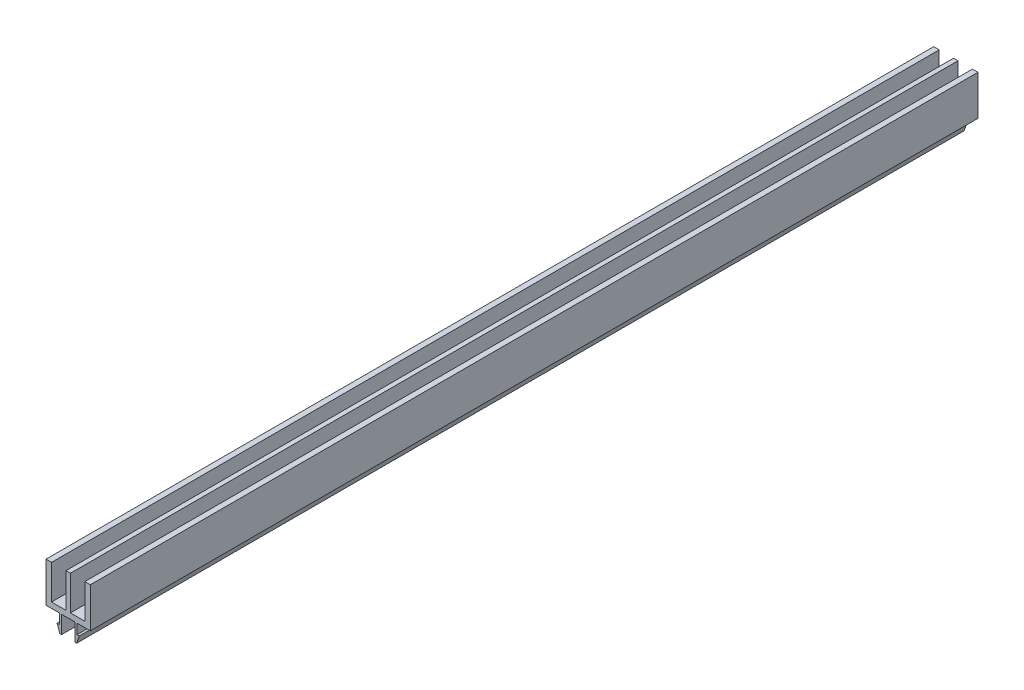
ISO-10303-21;
HEADER;
FILE_DESCRIPTION(('STEP AP214'),'2;1');
FILE_NAME('part.step','',(''),(''),'','','');
FILE_SCHEMA(('AUTOMOTIVE_DESIGN { 1 0 10303 214 1 1 1 1 }'));
ENDSEC;
DATA;
#1=APPLICATION_CONTEXT('core data for automotive mechanical design processes');
#2=APPLICATION_PROTOCOL_DEFINITION('international standard','automotive_design',2000,#1);
#3=PRODUCT_CONTEXT('',#1,'mechanical');
#4=PRODUCT('Part','Part','',(#3));
#5=PRODUCT_RELATED_PRODUCT_CATEGORY('part','',(#4));
#6=PRODUCT_DEFINITION_FORMATION('','',#4);
#7=PRODUCT_DEFINITION_CONTEXT('part definition',#1,'design');
#8=PRODUCT_DEFINITION('design','',#6,#7);
#9=PRODUCT_DEFINITION_SHAPE('','',#8);
#10=(LENGTH_UNIT() NAMED_UNIT(*) SI_UNIT(.MILLI.,.METRE.));
#11=(NAMED_UNIT(*) PLANE_ANGLE_UNIT() SI_UNIT($,.RADIAN.));
#12=(NAMED_UNIT(*) SI_UNIT($,.STERADIAN.) SOLID_ANGLE_UNIT());
#13=UNCERTAINTY_MEASURE_WITH_UNIT(LENGTH_MEASURE(1.E-05),#10,'distance_accuracy_value','');
#14=(GEOMETRIC_REPRESENTATION_CONTEXT(3) GLOBAL_UNCERTAINTY_ASSIGNED_CONTEXT((#13)) GLOBAL_UNIT_ASSIGNED_CONTEXT((#10,
#11,#12)) REPRESENTATION_CONTEXT('',''));
#15=CARTESIAN_POINT('',(0.,0.,0.));
#16=DIRECTION('',(0.,0.,1.));
#17=DIRECTION('',(1.,0.,0.));
#18=AXIS2_PLACEMENT_3D('',#15,#16,#17);
#19=CARTESIAN_POINT('',(-1.,17.9999999975,-350.29));
#20=DIRECTION('',(-1.,0.,0.));
#21=DIRECTION('',(0.,-1.,0.));
#22=AXIS2_PLACEMENT_3D('',#19,#20,#21);
#23=PLANE('',#22);
#24=DIRECTION('',(0.,-1.,0.));
#25=VECTOR('',#24,1.);
#26=CARTESIAN_POINT('',(-1.,17.9999999975,50.));
#27=LINE('',#26,#25);
#28=CARTESIAN_POINT('',(-1.,17.9999999975,50.));
#29=VERTEX_POINT('',#28);
#30=CARTESIAN_POINT('',(-1.,2.4999999995,50.));
#31=VERTEX_POINT('',#30);
#32=EDGE_CURVE('E225',#29,#31,#27,.T.);
#33=ORIENTED_EDGE('',*,*,#32,.F.);
#34=DIRECTION('',(0.,0.,1.));
#35=VECTOR('',#34,1.);
#36=CARTESIAN_POINT('',(-1.,17.9999999975,-350.29));
#37=LINE('',#36,#35);
#38=CARTESIAN_POINT('',(-1.,17.9999999975,-350.29));
#39=VERTEX_POINT('',#38);
#40=EDGE_CURVE('E11',#39,#29,#37,.T.);
#41=ORIENTED_EDGE('',*,*,#40,.F.);
#42=DIRECTION('',(0.,-1.,0.));
#43=VECTOR('',#42,1.);
#44=CARTESIAN_POINT('',(-1.,17.9999999975,-350.29));
#45=LINE('',#44,#43);
#46=CARTESIAN_POINT('',(-1.,2.4999999995,-350.29));
#47=VERTEX_POINT('',#46);
#48=EDGE_CURVE('E293',#39,#47,#45,.T.);
#49=ORIENTED_EDGE('',*,*,#48,.T.);
#50=DIRECTION('',(0.,0.,1.));
#51=VECTOR('',#50,1.);
#52=CARTESIAN_POINT('',(-1.,2.4999999995,-350.29));
#53=LINE('',#52,#51);
#54=EDGE_CURVE('E35',#47,#31,#53,.T.);
#55=ORIENTED_EDGE('',*,*,#54,.T.);
#56=EDGE_LOOP('',(#33,#41,#49,#55));
#57=FACE_BOUND('',#56,.T.);
#58=ADVANCED_FACE('F32',(#57),#23,.T.);
#59=CARTESIAN_POINT('',(0.999999999999998,17.9999999975,-350.29));
#60=DIRECTION('',(0.,1.,0.));
#61=DIRECTION('',(0.,0.,1.));
#62=AXIS2_PLACEMENT_3D('',#59,#60,#61);
#63=PLANE('',#62);
#64=DIRECTION('',(-1.,0.,0.));
#65=VECTOR('',#64,1.);
#66=CARTESIAN_POINT('',(0.999999999999998,17.9999999975,50.));
#67=LINE('',#66,#65);
#68=CARTESIAN_POINT('',(0.999999999999998,17.9999999975,50.));
#69=VERTEX_POINT('',#68);
#70=EDGE_CURVE('E291',#69,#29,#67,.T.);
#71=ORIENTED_EDGE('',*,*,#70,.F.);
#72=DIRECTION('',(0.,0.,1.));
#73=VECTOR('',#72,1.);
#74=CARTESIAN_POINT('',(0.999999999999998,17.9999999975,-350.29));
#75=LINE('',#74,#73);
#76=CARTESIAN_POINT('',(0.999999999999998,17.9999999975,-350.29));
#77=VERTEX_POINT('',#76);
#78=EDGE_CURVE('E41',#77,#69,#75,.T.);
#79=ORIENTED_EDGE('',*,*,#78,.F.);
#80=DIRECTION('',(-1.,0.,0.));
#81=VECTOR('',#80,1.);
#82=CARTESIAN_POINT('',(0.999999999999998,17.9999999975,-350.29));
#83=LINE('',#82,#81);
#84=EDGE_CURVE('E215',#77,#39,#83,.T.);
#85=ORIENTED_EDGE('',*,*,#84,.T.);
#86=ORIENTED_EDGE('',*,*,#40,.T.);
#87=EDGE_LOOP('',(#71,#79,#85,#86));
#88=FACE_BOUND('',#87,.T.);
#89=ADVANCED_FACE('F337',(#88),#63,.T.);
#90=CARTESIAN_POINT('',(0.999999999999998,2.4999999995,-350.29));
#91=DIRECTION('',(1.,0.,0.));
#92=DIRECTION('',(0.,0.,-1.));
#93=AXIS2_PLACEMENT_3D('',#90,#91,#92);
#94=PLANE('',#93);
#95=DIRECTION('',(0.,1.,0.));
#96=VECTOR('',#95,1.);
#97=CARTESIAN_POINT('',(0.999999999999998,2.4999999995,50.));
#98=LINE('',#97,#96);
#99=CARTESIAN_POINT('',(0.999999999999998,2.4999999995,50.));
#100=VERTEX_POINT('',#99);
#101=EDGE_CURVE('E202',#100,#69,#98,.T.);
#102=ORIENTED_EDGE('',*,*,#101,.F.);
#103=DIRECTION('',(0.,0.,1.));
#104=VECTOR('',#103,1.);
#105=CARTESIAN_POINT('',(0.999999999999998,2.4999999995,-350.29));
#106=LINE('',#105,#104);
#107=CARTESIAN_POINT('',(0.999999999999998,2.4999999995,-350.29));
#108=VERTEX_POINT('',#107);
#109=EDGE_CURVE('E197',#108,#100,#106,.T.);
#110=ORIENTED_EDGE('',*,*,#109,.F.);
#111=DIRECTION('',(0.,1.,0.));
#112=VECTOR('',#111,1.);
#113=CARTESIAN_POINT('',(0.999999999999998,2.4999999995,-350.29));
#114=LINE('',#113,#112);
#115=EDGE_CURVE('E200',#108,#77,#114,.T.);
#116=ORIENTED_EDGE('',*,*,#115,.T.);
#117=ORIENTED_EDGE('',*,*,#78,.T.);
#118=EDGE_LOOP('',(#102,#110,#116,#117));
#119=FACE_BOUND('',#118,.T.);
#120=ADVANCED_FACE('F199',(#119),#94,.T.);
#121=CARTESIAN_POINT('',(7.5,2.4999999995,-350.29));
#122=DIRECTION('',(0.,1.,0.));
#123=DIRECTION('',(-1.,0.,0.));
#124=AXIS2_PLACEMENT_3D('',#121,#122,#123);
#125=PLANE('',#124);
#126=DIRECTION('',(-1.,0.,0.));
#127=VECTOR('',#126,1.);
#128=CARTESIAN_POINT('',(7.5,2.4999999995,50.));
#129=LINE('',#128,#127);
#130=CARTESIAN_POINT('',(7.5,2.4999999995,50.));
#131=VERTEX_POINT('',#130);
#132=EDGE_CURVE('E288',#131,#100,#129,.T.);
#133=ORIENTED_EDGE('',*,*,#132,.F.);
#134=DIRECTION('',(0.,0.,1.));
#135=VECTOR('',#134,1.);
#136=CARTESIAN_POINT('',(7.5,2.4999999995,-350.29));
#137=LINE('',#136,#135);
#138=CARTESIAN_POINT('',(7.5,2.4999999995,-350.29));
#139=VERTEX_POINT('',#138);
#140=EDGE_CURVE('E207',#139,#131,#137,.T.);
#141=ORIENTED_EDGE('',*,*,#140,.F.);
#142=DIRECTION('',(-1.,0.,0.));
#143=VECTOR('',#142,1.);
#144=CARTESIAN_POINT('',(7.5,2.4999999995,-350.29));
#145=LINE('',#144,#143);
#146=EDGE_CURVE('E213',#139,#108,#145,.T.);
#147=ORIENTED_EDGE('',*,*,#146,.T.);
#148=ORIENTED_EDGE('',*,*,#109,.T.);
#149=EDGE_LOOP('',(#133,#141,#147,#148));
#150=FACE_BOUND('',#149,.T.);
#151=ADVANCED_FACE('F217',(#150),#125,.T.);
#152=CARTESIAN_POINT('',(7.5,17.9999999975,-350.29));
#153=DIRECTION('',(-1.,0.,0.));
#154=DIRECTION('',(0.,-1.,0.));
#155=AXIS2_PLACEMENT_3D('',#152,#153,#154);
#156=PLANE('',#155);
#157=DIRECTION('',(0.,-1.,0.));
#158=VECTOR('',#157,1.);
#159=CARTESIAN_POINT('',(7.5,17.9999999975,50.));
#160=LINE('',#159,#158);
#161=CARTESIAN_POINT('',(7.5,17.9999999975,50.));
#162=VERTEX_POINT('',#161);
#163=EDGE_CURVE('E285',#162,#131,#160,.T.);
#164=ORIENTED_EDGE('',*,*,#163,.F.);
#165=DIRECTION('',(0.,0.,1.));
#166=VECTOR('',#165,1.);
#167=CARTESIAN_POINT('',(7.5,17.9999999975,-350.29));
#168=LINE('',#167,#166);
#169=CARTESIAN_POINT('',(7.5,17.9999999975,-350.29));
#170=VERTEX_POINT('',#169);
#171=EDGE_CURVE('E297',#170,#162,#168,.T.);
#172=ORIENTED_EDGE('',*,*,#171,.F.);
#173=DIRECTION('',(0.,-1.,0.));
#174=VECTOR('',#173,1.);
#175=CARTESIAN_POINT('',(7.5,17.9999999975,-350.29));
#176=LINE('',#175,#174);
#177=EDGE_CURVE('E218',#170,#139,#176,.T.);
#178=ORIENTED_EDGE('',*,*,#177,.T.);
#179=ORIENTED_EDGE('',*,*,#140,.T.);
#180=EDGE_LOOP('',(#164,#172,#178,#179));
#181=FACE_BOUND('',#180,.T.);
#182=ADVANCED_FACE('F350',(#181),#156,.T.);
#183=CARTESIAN_POINT('',(10.,17.9999999975,-350.29));
#184=DIRECTION('',(0.,1.,0.));
#185=DIRECTION('',(0.,0.,1.));
#186=AXIS2_PLACEMENT_3D('',#183,#184,#185);
#187=PLANE('',#186);
#188=DIRECTION('',(-1.,0.,0.));
#189=VECTOR('',#188,1.);
#190=CARTESIAN_POINT('',(10.,17.9999999975,50.));
#191=LINE('',#190,#189);
#192=CARTESIAN_POINT('',(10.,17.9999999975,50.));
#193=VERTEX_POINT('',#192);
#194=EDGE_CURVE('E282',#193,#162,#191,.T.);
#195=ORIENTED_EDGE('',*,*,#194,.F.);
#196=DIRECTION('',(0.,0.,1.));
#197=VECTOR('',#196,1.);
#198=CARTESIAN_POINT('',(10.,17.9999999975,-350.29));
#199=LINE('',#198,#197);
#200=CARTESIAN_POINT('',(10.,17.9999999975,-350.29));
#201=VERTEX_POINT('',#200);
#202=EDGE_CURVE('E299',#201,#193,#199,.T.);
#203=ORIENTED_EDGE('',*,*,#202,.F.);
#204=DIRECTION('',(-1.,0.,0.));
#205=VECTOR('',#204,1.);
#206=CARTESIAN_POINT('',(10.,17.9999999975,-350.29));
#207=LINE('',#206,#205);
#208=EDGE_CURVE('E220',#201,#170,#207,.T.);
#209=ORIENTED_EDGE('',*,*,#208,.T.);
#210=ORIENTED_EDGE('',*,*,#171,.T.);
#211=EDGE_LOOP('',(#195,#203,#209,#210));
#212=FACE_BOUND('',#211,.T.);
#213=ADVANCED_FACE('F353',(#212),#187,.T.);
#214=CARTESIAN_POINT('',(10.,-4.99999828349541E-10,-350.29));
#215=DIRECTION('',(1.,0.,0.));
#216=DIRECTION('',(0.,0.,-1.));
#217=AXIS2_PLACEMENT_3D('',#214,#215,#216);
#218=PLANE('',#217);
#219=DIRECTION('',(0.,1.,0.));
#220=VECTOR('',#219,1.);
#221=CARTESIAN_POINT('',(10.,-4.99999828349541E-10,50.));
#222=LINE('',#221,#220);
#223=CARTESIAN_POINT('',(10.,-4.99999828349541E-10,50.));
#224=VERTEX_POINT('',#223);
#225=EDGE_CURVE('E279',#224,#193,#222,.T.);
#226=ORIENTED_EDGE('',*,*,#225,.F.);
#227=DIRECTION('',(0.,0.,1.));
#228=VECTOR('',#227,1.);
#229=CARTESIAN_POINT('',(10.,-4.99999828349541E-10,-350.29));
#230=LINE('',#229,#228);
#231=CARTESIAN_POINT('',(10.,-4.99999828349541E-10,-350.29));
#232=VERTEX_POINT('',#231);
#233=EDGE_CURVE('E301',#232,#224,#230,.T.);
#234=ORIENTED_EDGE('',*,*,#233,.F.);
#235=DIRECTION('',(0.,1.,0.));
#236=VECTOR('',#235,1.);
#237=CARTESIAN_POINT('',(10.,-4.99999828349541E-10,-350.29));
#238=LINE('',#237,#236);
#239=EDGE_CURVE('E643',#232,#201,#238,.T.);
#240=ORIENTED_EDGE('',*,*,#239,.T.);
#241=ORIENTED_EDGE('',*,*,#202,.T.);
#242=EDGE_LOOP('',(#226,#234,#240,#241));
#243=FACE_BOUND('',#242,.T.);
#244=ADVANCED_FACE('F357',(#243),#218,.T.);
#245=CARTESIAN_POINT('',(4.,-4.99999998002099E-10,-350.29));
#246=DIRECTION('',(0.,-1.,0.));
#247=DIRECTION('',(1.,0.,0.));
#248=AXIS2_PLACEMENT_3D('',#245,#246,#247);
#249=PLANE('',#248);
#250=DIRECTION('',(1.,0.,0.));
#251=VECTOR('',#250,1.);
#252=CARTESIAN_POINT('',(4.,-4.99999998002099E-10,50.));
#253=LINE('',#252,#251);
#254=CARTESIAN_POINT('',(4.,-4.99999998002099E-10,50.));
#255=VERTEX_POINT('',#254);
#256=EDGE_CURVE('E276',#255,#224,#253,.T.);
#257=ORIENTED_EDGE('',*,*,#256,.F.);
#258=DIRECTION('',(0.,0.,1.));
#259=VECTOR('',#258,1.);
#260=CARTESIAN_POINT('',(4.,-4.99999998002099E-10,-350.29));
#261=LINE('',#260,#259);
#262=CARTESIAN_POINT('',(4.,-4.99999998002099E-10,-350.29));
#263=VERTEX_POINT('',#262);
#264=EDGE_CURVE('E303',#263,#255,#261,.T.);
#265=ORIENTED_EDGE('',*,*,#264,.F.);
#266=DIRECTION('',(1.,0.,0.));
#267=VECTOR('',#266,1.);
#268=CARTESIAN_POINT('',(4.,-4.99999998002099E-10,-350.29));
#269=LINE('',#268,#267);
#270=EDGE_CURVE('E647',#263,#232,#269,.T.);
#271=ORIENTED_EDGE('',*,*,#270,.T.);
#272=ORIENTED_EDGE('',*,*,#233,.T.);
#273=EDGE_LOOP('',(#257,#265,#271,#272));
#274=FACE_BOUND('',#273,.T.);
#275=ADVANCED_FACE('F361',(#274),#249,.T.);
#276=CARTESIAN_POINT('',(4.,-4.5,-350.29));
#277=DIRECTION('',(1.,0.,0.));
#278=DIRECTION('',(0.,0.,-1.));
#279=AXIS2_PLACEMENT_3D('',#276,#277,#278);
#280=PLANE('',#279);
#281=DIRECTION('',(0.,1.,0.));
#282=VECTOR('',#281,1.);
#283=CARTESIAN_POINT('',(4.,-4.5,50.));
#284=LINE('',#283,#282);
#285=CARTESIAN_POINT('',(4.,-4.5,50.));
#286=VERTEX_POINT('',#285);
#287=EDGE_CURVE('E273',#286,#255,#284,.T.);
#288=ORIENTED_EDGE('',*,*,#287,.F.);
#289=DIRECTION('',(0.,0.,1.));
#290=VECTOR('',#289,1.);
#291=CARTESIAN_POINT('',(4.,-4.5,-350.29));
#292=LINE('',#291,#290);
#293=CARTESIAN_POINT('',(4.,-4.5,-350.29));
#294=VERTEX_POINT('',#293);
#295=EDGE_CURVE('E305',#294,#286,#292,.T.);
#296=ORIENTED_EDGE('',*,*,#295,.F.);
#297=DIRECTION('',(0.,1.,0.));
#298=VECTOR('',#297,1.);
#299=CARTESIAN_POINT('',(4.,-4.5,-350.29));
#300=LINE('',#299,#298);
#301=EDGE_CURVE('E636',#294,#263,#300,.T.);
#302=ORIENTED_EDGE('',*,*,#301,.T.);
#303=ORIENTED_EDGE('',*,*,#264,.T.);
#304=EDGE_LOOP('',(#288,#296,#302,#303));
#305=FACE_BOUND('',#304,.T.);
#306=ADVANCED_FACE('F365',(#305),#280,.T.);
#307=CARTESIAN_POINT('',(5.,-4.5,-350.29));
#308=DIRECTION('',(0.,1.,0.));
#309=DIRECTION('',(0.,0.,1.));
#310=AXIS2_PLACEMENT_3D('',#307,#308,#309);
#311=PLANE('',#310);
#312=DIRECTION('',(-1.,0.,0.));
#313=VECTOR('',#312,1.);
#314=CARTESIAN_POINT('',(5.,-4.5,50.));
#315=LINE('',#314,#313);
#316=CARTESIAN_POINT('',(5.,-4.5,50.));
#317=VERTEX_POINT('',#316);
#318=EDGE_CURVE('E270',#317,#286,#315,.T.);
#319=ORIENTED_EDGE('',*,*,#318,.F.);
#320=DIRECTION('',(0.,0.,1.));
#321=VECTOR('',#320,1.);
#322=CARTESIAN_POINT('',(5.,-4.5,-350.29));
#323=LINE('',#322,#321);
#324=CARTESIAN_POINT('',(5.,-4.5,-350.29));
#325=VERTEX_POINT('',#324);
#326=EDGE_CURVE('E307',#325,#317,#323,.T.);
#327=ORIENTED_EDGE('',*,*,#326,.F.);
#328=DIRECTION('',(-1.,0.,0.));
#329=VECTOR('',#328,1.);
#330=CARTESIAN_POINT('',(5.,-4.5,-350.29));
#331=LINE('',#330,#329);
#332=EDGE_CURVE('E632',#325,#294,#331,.T.);
#333=ORIENTED_EDGE('',*,*,#332,.T.);
#334=ORIENTED_EDGE('',*,*,#295,.T.);
#335=EDGE_LOOP('',(#319,#327,#333,#334));
#336=FACE_BOUND('',#335,.T.);
#337=ADVANCED_FACE('F369',(#336),#311,.T.);
#338=CARTESIAN_POINT('',(3.75,-8.,-350.29));
#339=DIRECTION('',(0.941741911594837,-0.336336396998157,0.));
#340=DIRECTION('',(0.336336396998157,0.941741911594837,0.));
#341=AXIS2_PLACEMENT_3D('',#338,#339,#340);
#342=PLANE('',#341);
#343=DIRECTION('',(0.336336396998157,0.941741911594837,0.));
#344=VECTOR('',#343,1.);
#345=CARTESIAN_POINT('',(3.75,-8.,50.));
#346=LINE('',#345,#344);
#347=CARTESIAN_POINT('',(3.75,-8.,50.));
#348=VERTEX_POINT('',#347);
#349=EDGE_CURVE('E267',#348,#317,#346,.T.);
#350=ORIENTED_EDGE('',*,*,#349,.F.);
#351=DIRECTION('',(0.,0.,1.));
#352=VECTOR('',#351,1.);
#353=CARTESIAN_POINT('',(3.75,-8.,-350.29));
#354=LINE('',#353,#352);
#355=CARTESIAN_POINT('',(3.75,-8.,-350.29));
#356=VERTEX_POINT('',#355);
#357=EDGE_CURVE('E309',#356,#348,#354,.T.);
#358=ORIENTED_EDGE('',*,*,#357,.F.);
#359=DIRECTION('',(0.336336396998157,0.941741911594837,0.));
#360=VECTOR('',#359,1.);
#361=CARTESIAN_POINT('',(3.75,-8.,-350.29));
#362=LINE('',#361,#360);
#363=EDGE_CURVE('E653',#356,#325,#362,.T.);
#364=ORIENTED_EDGE('',*,*,#363,.T.);
#365=ORIENTED_EDGE('',*,*,#326,.T.);
#366=EDGE_LOOP('',(#350,#358,#364,#365));
#367=FACE_BOUND('',#366,.T.);
#368=ADVANCED_FACE('F373',(#367),#342,.T.);
#369=CARTESIAN_POINT('',(3.,-8.,-350.29));
#370=DIRECTION('',(0.,-1.,0.));
#371=DIRECTION('',(0.,0.,-1.));
#372=AXIS2_PLACEMENT_3D('',#369,#370,#371);
#373=PLANE('',#372);
#374=DIRECTION('',(1.,0.,0.));
#375=VECTOR('',#374,1.);
#376=CARTESIAN_POINT('',(3.,-8.,50.));
#377=LINE('',#376,#375);
#378=CARTESIAN_POINT('',(3.,-8.,50.));
#379=VERTEX_POINT('',#378);
#380=EDGE_CURVE('E264',#379,#348,#377,.T.);
#381=ORIENTED_EDGE('',*,*,#380,.F.);
#382=DIRECTION('',(0.,0.,1.));
#383=VECTOR('',#382,1.);
#384=CARTESIAN_POINT('',(3.,-8.,-350.29));
#385=LINE('',#384,#383);
#386=CARTESIAN_POINT('',(3.,-8.,-350.29));
#387=VERTEX_POINT('',#386);
#388=EDGE_CURVE('E311',#387,#379,#385,.T.);
#389=ORIENTED_EDGE('',*,*,#388,.F.);
#390=DIRECTION('',(1.,0.,0.));
#391=VECTOR('',#390,1.);
#392=CARTESIAN_POINT('',(3.,-8.,-350.29));
#393=LINE('',#392,#391);
#394=EDGE_CURVE('E625',#387,#356,#393,.T.);
#395=ORIENTED_EDGE('',*,*,#394,.T.);
#396=ORIENTED_EDGE('',*,*,#357,.T.);
#397=EDGE_LOOP('',(#381,#389,#395,#396));
#398=FACE_BOUND('',#397,.T.);
#399=ADVANCED_FACE('F377',(#398),#373,.T.);
#400=CARTESIAN_POINT('',(3.,-4.9999985194348E-10,-350.29));
#401=DIRECTION('',(-1.,0.,0.));
#402=DIRECTION('',(0.,0.,1.));
#403=AXIS2_PLACEMENT_3D('',#400,#401,#402);
#404=PLANE('',#403);
#405=DIRECTION('',(0.,-1.,0.));
#406=VECTOR('',#405,1.);
#407=CARTESIAN_POINT('',(3.,-4.9999985194348E-10,50.));
#408=LINE('',#407,#406);
#409=CARTESIAN_POINT('',(3.,-4.9999985194348E-10,50.));
#410=VERTEX_POINT('',#409);
#411=EDGE_CURVE('E261',#410,#379,#408,.T.);
#412=ORIENTED_EDGE('',*,*,#411,.F.);
#413=DIRECTION('',(0.,0.,1.));
#414=VECTOR('',#413,1.);
#415=CARTESIAN_POINT('',(3.,-4.9999985194348E-10,-350.29));
#416=LINE('',#415,#414);
#417=CARTESIAN_POINT('',(3.,-4.9999985194348E-10,-350.29));
#418=VERTEX_POINT('',#417);
#419=EDGE_CURVE('E313',#418,#410,#416,.T.);
#420=ORIENTED_EDGE('',*,*,#419,.F.);
#421=DIRECTION('',(0.,-1.,0.));
#422=VECTOR('',#421,1.);
#423=CARTESIAN_POINT('',(3.,-4.9999985194348E-10,-350.29));
#424=LINE('',#423,#422);
#425=EDGE_CURVE('E621',#418,#387,#424,.T.);
#426=ORIENTED_EDGE('',*,*,#425,.T.);
#427=ORIENTED_EDGE('',*,*,#388,.T.);
#428=EDGE_LOOP('',(#412,#420,#426,#427));
#429=FACE_BOUND('',#428,.T.);
#430=ADVANCED_FACE('F381',(#429),#404,.T.);
#431=CARTESIAN_POINT('',(-3.,-4.99999455901012E-10,-350.29));
#432=DIRECTION('',(0.,-1.,0.));
#433=DIRECTION('',(1.,0.,0.));
#434=AXIS2_PLACEMENT_3D('',#431,#432,#433);
#435=PLANE('',#434);
#436=DIRECTION('',(1.,0.,0.));
#437=VECTOR('',#436,1.);
#438=CARTESIAN_POINT('',(-3.,-4.99999455901012E-10,50.));
#439=LINE('',#438,#437);
#440=CARTESIAN_POINT('',(-3.,-4.99999455901012E-10,50.));
#441=VERTEX_POINT('',#440);
#442=EDGE_CURVE('E258',#441,#410,#439,.T.);
#443=ORIENTED_EDGE('',*,*,#442,.F.);
#444=DIRECTION('',(0.,0.,1.));
#445=VECTOR('',#444,1.);
#446=CARTESIAN_POINT('',(-3.,-4.99999455901012E-10,-350.29));
#447=LINE('',#446,#445);
#448=CARTESIAN_POINT('',(-3.,-4.99999455901012E-10,-350.29));
#449=VERTEX_POINT('',#448);
#450=EDGE_CURVE('E315',#449,#441,#447,.T.);
#451=ORIENTED_EDGE('',*,*,#450,.F.);
#452=DIRECTION('',(1.,0.,0.));
#453=VECTOR('',#452,1.);
#454=CARTESIAN_POINT('',(-3.,-4.99999455901012E-10,-350.29));
#455=LINE('',#454,#453);
#456=EDGE_CURVE('E657',#449,#418,#455,.T.);
#457=ORIENTED_EDGE('',*,*,#456,.T.);
#458=ORIENTED_EDGE('',*,*,#419,.T.);
#459=EDGE_LOOP('',(#443,#451,#457,#458));
#460=FACE_BOUND('',#459,.T.);
#461=ADVANCED_FACE('F385',(#460),#435,.T.);
#462=CARTESIAN_POINT('',(-3.,-8.,-350.29));
#463=DIRECTION('',(1.,0.,0.));
#464=DIRECTION('',(0.,0.,-1.));
#465=AXIS2_PLACEMENT_3D('',#462,#463,#464);
#466=PLANE('',#465);
#467=DIRECTION('',(0.,1.,0.));
#468=VECTOR('',#467,1.);
#469=CARTESIAN_POINT('',(-3.,-8.,50.));
#470=LINE('',#469,#468);
#471=CARTESIAN_POINT('',(-3.,-8.,50.));
#472=VERTEX_POINT('',#471);
#473=EDGE_CURVE('E255',#472,#441,#470,.T.);
#474=ORIENTED_EDGE('',*,*,#473,.F.);
#475=DIRECTION('',(0.,0.,1.));
#476=VECTOR('',#475,1.);
#477=CARTESIAN_POINT('',(-3.,-8.,-350.29));
#478=LINE('',#477,#476);
#479=CARTESIAN_POINT('',(-3.,-8.,-350.29));
#480=VERTEX_POINT('',#479);
#481=EDGE_CURVE('E317',#480,#472,#478,.T.);
#482=ORIENTED_EDGE('',*,*,#481,.F.);
#483=DIRECTION('',(0.,1.,0.));
#484=VECTOR('',#483,1.);
#485=CARTESIAN_POINT('',(-3.,-8.,-350.29));
#486=LINE('',#485,#484);
#487=EDGE_CURVE('E614',#480,#449,#486,.T.);
#488=ORIENTED_EDGE('',*,*,#487,.T.);
#489=ORIENTED_EDGE('',*,*,#450,.T.);
#490=EDGE_LOOP('',(#474,#482,#488,#489));
#491=FACE_BOUND('',#490,.T.);
#492=ADVANCED_FACE('F389',(#491),#466,.T.);
#493=CARTESIAN_POINT('',(-3.75,-8.,-350.29));
#494=DIRECTION('',(0.,-1.,0.));
#495=DIRECTION('',(0.,0.,-1.));
#496=AXIS2_PLACEMENT_3D('',#493,#494,#495);
#497=PLANE('',#496);
#498=DIRECTION('',(1.,0.,0.));
#499=VECTOR('',#498,1.);
#500=CARTESIAN_POINT('',(-3.75,-8.,50.));
#501=LINE('',#500,#499);
#502=CARTESIAN_POINT('',(-3.75,-8.,50.));
#503=VERTEX_POINT('',#502);
#504=EDGE_CURVE('E252',#503,#472,#501,.T.);
#505=ORIENTED_EDGE('',*,*,#504,.F.);
#506=DIRECTION('',(0.,0.,1.));
#507=VECTOR('',#506,1.);
#508=CARTESIAN_POINT('',(-3.75,-8.,-350.29));
#509=LINE('',#508,#507);
#510=CARTESIAN_POINT('',(-3.75,-8.,-350.29));
#511=VERTEX_POINT('',#510);
#512=EDGE_CURVE('E319',#511,#503,#509,.T.);
#513=ORIENTED_EDGE('',*,*,#512,.F.);
#514=DIRECTION('',(1.,0.,0.));
#515=VECTOR('',#514,1.);
#516=CARTESIAN_POINT('',(-3.75,-8.,-350.29));
#517=LINE('',#516,#515);
#518=EDGE_CURVE('E610',#511,#480,#517,.T.);
#519=ORIENTED_EDGE('',*,*,#518,.T.);
#520=ORIENTED_EDGE('',*,*,#481,.T.);
#521=EDGE_LOOP('',(#505,#513,#519,#520));
#522=FACE_BOUND('',#521,.T.);
#523=ADVANCED_FACE('F393',(#522),#497,.T.);
#524=CARTESIAN_POINT('',(-5.,-4.5,-350.29));
#525=DIRECTION('',(-0.941741911594838,-0.336336396998156,0.));
#526=DIRECTION('',(0.336336396998156,-0.941741911594838,0.));
#527=AXIS2_PLACEMENT_3D('',#524,#525,#526);
#528=PLANE('',#527);
#529=DIRECTION('',(0.336336396998156,-0.941741911594837,0.));
#530=VECTOR('',#529,1.);
#531=CARTESIAN_POINT('',(-5.,-4.5,50.));
#532=LINE('',#531,#530);
#533=CARTESIAN_POINT('',(-5.,-4.5,50.));
#534=VERTEX_POINT('',#533);
#535=EDGE_CURVE('E249',#534,#503,#532,.T.);
#536=ORIENTED_EDGE('',*,*,#535,.F.);
#537=DIRECTION('',(0.,0.,1.));
#538=VECTOR('',#537,1.);
#539=CARTESIAN_POINT('',(-5.,-4.5,-350.29));
#540=LINE('',#539,#538);
#541=CARTESIAN_POINT('',(-5.,-4.5,-350.29));
#542=VERTEX_POINT('',#541);
#543=EDGE_CURVE('E321',#542,#534,#540,.T.);
#544=ORIENTED_EDGE('',*,*,#543,.F.);
#545=DIRECTION('',(0.336336396998156,-0.941741911594837,0.));
#546=VECTOR('',#545,1.);
#547=CARTESIAN_POINT('',(-5.,-4.5,-350.29));
#548=LINE('',#547,#546);
#549=EDGE_CURVE('E661',#542,#511,#548,.T.);
#550=ORIENTED_EDGE('',*,*,#549,.T.);
#551=ORIENTED_EDGE('',*,*,#512,.T.);
#552=EDGE_LOOP('',(#536,#544,#550,#551));
#553=FACE_BOUND('',#552,.T.);
#554=ADVANCED_FACE('F397',(#553),#528,.T.);
#555=CARTESIAN_POINT('',(-4.,-4.5,-350.29));
#556=DIRECTION('',(0.,1.,0.));
#557=DIRECTION('',(0.,0.,1.));
#558=AXIS2_PLACEMENT_3D('',#555,#556,#557);
#559=PLANE('',#558);
#560=DIRECTION('',(-1.,0.,0.));
#561=VECTOR('',#560,1.);
#562=CARTESIAN_POINT('',(-4.,-4.5,50.));
#563=LINE('',#562,#561);
#564=CARTESIAN_POINT('',(-4.,-4.5,50.));
#565=VERTEX_POINT('',#564);
#566=EDGE_CURVE('E246',#565,#534,#563,.T.);
#567=ORIENTED_EDGE('',*,*,#566,.F.);
#568=DIRECTION('',(0.,0.,1.));
#569=VECTOR('',#568,1.);
#570=CARTESIAN_POINT('',(-4.,-4.5,-350.29));
#571=LINE('',#570,#569);
#572=CARTESIAN_POINT('',(-4.,-4.5,-350.29));
#573=VERTEX_POINT('',#572);
#574=EDGE_CURVE('E323',#573,#565,#571,.T.);
#575=ORIENTED_EDGE('',*,*,#574,.F.);
#576=DIRECTION('',(-1.,0.,0.));
#577=VECTOR('',#576,1.);
#578=CARTESIAN_POINT('',(-4.,-4.5,-350.29));
#579=LINE('',#578,#577);
#580=EDGE_CURVE('E603',#573,#542,#579,.T.);
#581=ORIENTED_EDGE('',*,*,#580,.T.);
#582=ORIENTED_EDGE('',*,*,#543,.T.);
#583=EDGE_LOOP('',(#567,#575,#581,#582));
#584=FACE_BOUND('',#583,.T.);
#585=ADVANCED_FACE('F401',(#584),#559,.T.);
#586=CARTESIAN_POINT('',(-4.,-4.9999985194348E-10,-350.29));
#587=DIRECTION('',(-1.,0.,0.));
#588=DIRECTION('',(0.,0.,1.));
#589=AXIS2_PLACEMENT_3D('',#586,#587,#588);
#590=PLANE('',#589);
#591=DIRECTION('',(0.,-1.,0.));
#592=VECTOR('',#591,1.);
#593=CARTESIAN_POINT('',(-4.,-4.9999985194348E-10,50.));
#594=LINE('',#593,#592);
#595=CARTESIAN_POINT('',(-4.,-4.9999985194348E-10,50.));
#596=VERTEX_POINT('',#595);
#597=EDGE_CURVE('E243',#596,#565,#594,.T.);
#598=ORIENTED_EDGE('',*,*,#597,.F.);
#599=DIRECTION('',(0.,0.,1.));
#600=VECTOR('',#599,1.);
#601=CARTESIAN_POINT('',(-4.,-4.9999985194348E-10,-350.29));
#602=LINE('',#601,#600);
#603=CARTESIAN_POINT('',(-4.,-4.9999985194348E-10,-350.29));
#604=VERTEX_POINT('',#603);
#605=EDGE_CURVE('E325',#604,#596,#602,.T.);
#606=ORIENTED_EDGE('',*,*,#605,.F.);
#607=DIRECTION('',(0.,-1.,0.));
#608=VECTOR('',#607,1.);
#609=CARTESIAN_POINT('',(-4.,-4.9999985194348E-10,-350.29));
#610=LINE('',#609,#608);
#611=EDGE_CURVE('E599',#604,#573,#610,.T.);
#612=ORIENTED_EDGE('',*,*,#611,.T.);
#613=ORIENTED_EDGE('',*,*,#574,.T.);
#614=EDGE_LOOP('',(#598,#606,#612,#613));
#615=FACE_BOUND('',#614,.T.);
#616=ADVANCED_FACE('F405',(#615),#590,.T.);
#617=CARTESIAN_POINT('',(-10.,-4.99999719929324E-10,-350.29));
#618=DIRECTION('',(0.,-1.,0.));
#619=DIRECTION('',(1.,0.,0.));
#620=AXIS2_PLACEMENT_3D('',#617,#618,#619);
#621=PLANE('',#620);
#622=DIRECTION('',(1.,0.,0.));
#623=VECTOR('',#622,1.);
#624=CARTESIAN_POINT('',(-10.,-4.99999719929324E-10,50.));
#625=LINE('',#624,#623);
#626=CARTESIAN_POINT('',(-10.,-4.99999719929324E-10,50.));
#627=VERTEX_POINT('',#626);
#628=EDGE_CURVE('E240',#627,#596,#625,.T.);
#629=ORIENTED_EDGE('',*,*,#628,.F.);
#630=DIRECTION('',(0.,0.,1.));
#631=VECTOR('',#630,1.);
#632=CARTESIAN_POINT('',(-10.,-4.99999719929324E-10,-350.29));
#633=LINE('',#632,#631);
#634=CARTESIAN_POINT('',(-10.,-4.99999719929324E-10,-350.29));
#635=VERTEX_POINT('',#634);
#636=EDGE_CURVE('E327',#635,#627,#633,.T.);
#637=ORIENTED_EDGE('',*,*,#636,.F.);
#638=DIRECTION('',(1.,0.,0.));
#639=VECTOR('',#638,1.);
#640=CARTESIAN_POINT('',(-10.,-4.99999719929324E-10,-350.29));
#641=LINE('',#640,#639);
#642=EDGE_CURVE('E665',#635,#604,#641,.T.);
#643=ORIENTED_EDGE('',*,*,#642,.T.);
#644=ORIENTED_EDGE('',*,*,#605,.T.);
#645=EDGE_LOOP('',(#629,#637,#643,#644));
#646=FACE_BOUND('',#645,.T.);
#647=ADVANCED_FACE('F409',(#646),#621,.T.);
#648=CARTESIAN_POINT('',(-10.,17.9999999975,-350.29));
#649=DIRECTION('',(-1.,0.,0.));
#650=DIRECTION('',(0.,-1.,0.));
#651=AXIS2_PLACEMENT_3D('',#648,#649,#650);
#652=PLANE('',#651);
#653=DIRECTION('',(0.,-1.,0.));
#654=VECTOR('',#653,1.);
#655=CARTESIAN_POINT('',(-10.,17.9999999975,50.));
#656=LINE('',#655,#654);
#657=CARTESIAN_POINT('',(-10.,17.9999999975,50.));
#658=VERTEX_POINT('',#657);
#659=EDGE_CURVE('E237',#658,#627,#656,.T.);
#660=ORIENTED_EDGE('',*,*,#659,.F.);
#661=DIRECTION('',(0.,0.,1.));
#662=VECTOR('',#661,1.);
#663=CARTESIAN_POINT('',(-10.,17.9999999975,-350.29));
#664=LINE('',#663,#662);
#665=CARTESIAN_POINT('',(-10.,17.9999999975,-350.29));
#666=VERTEX_POINT('',#665);
#667=EDGE_CURVE('E329',#666,#658,#664,.T.);
#668=ORIENTED_EDGE('',*,*,#667,.F.);
#669=DIRECTION('',(0.,-1.,0.));
#670=VECTOR('',#669,1.);
#671=CARTESIAN_POINT('',(-10.,17.9999999975,-350.29));
#672=LINE('',#671,#670);
#673=EDGE_CURVE('E592',#666,#635,#672,.T.);
#674=ORIENTED_EDGE('',*,*,#673,.T.);
#675=ORIENTED_EDGE('',*,*,#636,.T.);
#676=EDGE_LOOP('',(#660,#668,#674,#675));
#677=FACE_BOUND('',#676,.T.);
#678=ADVANCED_FACE('F413',(#677),#652,.T.);
#679=CARTESIAN_POINT('',(-7.5,17.9999999975,-350.29));
#680=DIRECTION('',(0.,1.,0.));
#681=DIRECTION('',(0.,0.,1.));
#682=AXIS2_PLACEMENT_3D('',#679,#680,#681);
#683=PLANE('',#682);
#684=DIRECTION('',(-1.,0.,0.));
#685=VECTOR('',#684,1.);
#686=CARTESIAN_POINT('',(-7.5,17.9999999975,50.));
#687=LINE('',#686,#685);
#688=CARTESIAN_POINT('',(-7.5,17.9999999975,50.));
#689=VERTEX_POINT('',#688);
#690=EDGE_CURVE('E234',#689,#658,#687,.T.);
#691=ORIENTED_EDGE('',*,*,#690,.F.);
#692=DIRECTION('',(0.,0.,1.));
#693=VECTOR('',#692,1.);
#694=CARTESIAN_POINT('',(-7.5,17.9999999975,-350.29));
#695=LINE('',#694,#693);
#696=CARTESIAN_POINT('',(-7.5,17.9999999975,-350.29));
#697=VERTEX_POINT('',#696);
#698=EDGE_CURVE('E331',#697,#689,#695,.T.);
#699=ORIENTED_EDGE('',*,*,#698,.F.);
#700=DIRECTION('',(-1.,0.,0.));
#701=VECTOR('',#700,1.);
#702=CARTESIAN_POINT('',(-7.5,17.9999999975,-350.29));
#703=LINE('',#702,#701);
#704=EDGE_CURVE('E588',#697,#666,#703,.T.);
#705=ORIENTED_EDGE('',*,*,#704,.T.);
#706=ORIENTED_EDGE('',*,*,#667,.T.);
#707=EDGE_LOOP('',(#691,#699,#705,#706));
#708=FACE_BOUND('',#707,.T.);
#709=ADVANCED_FACE('F417',(#708),#683,.T.);
#710=CARTESIAN_POINT('',(-7.5,2.4999999995,-350.29));
#711=DIRECTION('',(1.,0.,0.));
#712=DIRECTION('',(0.,0.,-1.));
#713=AXIS2_PLACEMENT_3D('',#710,#711,#712);
#714=PLANE('',#713);
#715=DIRECTION('',(0.,1.,0.));
#716=VECTOR('',#715,1.);
#717=CARTESIAN_POINT('',(-7.5,2.4999999995,50.));
#718=LINE('',#717,#716);
#719=CARTESIAN_POINT('',(-7.5,2.4999999995,50.));
#720=VERTEX_POINT('',#719);
#721=EDGE_CURVE('E231',#720,#689,#718,.T.);
#722=ORIENTED_EDGE('',*,*,#721,.F.);
#723=DIRECTION('',(0.,0.,1.));
#724=VECTOR('',#723,1.);
#725=CARTESIAN_POINT('',(-7.5,2.4999999995,-350.29));
#726=LINE('',#725,#724);
#727=CARTESIAN_POINT('',(-7.5,2.4999999995,-350.29));
#728=VERTEX_POINT('',#727);
#729=EDGE_CURVE('E332',#728,#720,#726,.T.);
#730=ORIENTED_EDGE('',*,*,#729,.F.);
#731=DIRECTION('',(0.,1.,0.));
#732=VECTOR('',#731,1.);
#733=CARTESIAN_POINT('',(-7.5,2.4999999995,-350.29));
#734=LINE('',#733,#732);
#735=EDGE_CURVE('E669',#728,#697,#734,.T.);
#736=ORIENTED_EDGE('',*,*,#735,.T.);
#737=ORIENTED_EDGE('',*,*,#698,.T.);
#738=EDGE_LOOP('',(#722,#730,#736,#737));
#739=FACE_BOUND('',#738,.T.);
#740=ADVANCED_FACE('F421',(#739),#714,.T.);
#741=CARTESIAN_POINT('',(-1.,2.4999999995,-350.29));
#742=DIRECTION('',(0.,1.,0.));
#743=DIRECTION('',(-1.,0.,0.));
#744=AXIS2_PLACEMENT_3D('',#741,#742,#743);
#745=PLANE('',#744);
#746=DIRECTION('',(-1.,0.,0.));
#747=VECTOR('',#746,1.);
#748=CARTESIAN_POINT('',(-1.,2.4999999995,50.));
#749=LINE('',#748,#747);
#750=EDGE_CURVE('E228',#31,#720,#749,.T.);
#751=ORIENTED_EDGE('',*,*,#750,.F.);
#752=ORIENTED_EDGE('',*,*,#54,.F.);
#753=DIRECTION('',(-1.,0.,0.));
#754=VECTOR('',#753,1.);
#755=CARTESIAN_POINT('',(-1.,2.4999999995,-350.29));
#756=LINE('',#755,#754);
#757=EDGE_CURVE('E671',#47,#728,#756,.T.);
#758=ORIENTED_EDGE('',*,*,#757,.T.);
#759=ORIENTED_EDGE('',*,*,#729,.T.);
#760=EDGE_LOOP('',(#751,#752,#758,#759));
#761=FACE_BOUND('',#760,.T.);
#762=ADVANCED_FACE('F334',(#761),#745,.T.);
#763=CARTESIAN_POINT('',(0.,0.,-350.29));
#764=DIRECTION('',(0.,0.,-1.));
#765=DIRECTION('',(-1.,0.,0.));
#766=AXIS2_PLACEMENT_3D('',#763,#764,#765);
#767=PLANE('',#766);
#768=ORIENTED_EDGE('',*,*,#48,.F.);
#769=ORIENTED_EDGE('',*,*,#84,.F.);
#770=ORIENTED_EDGE('',*,*,#115,.F.);
#771=ORIENTED_EDGE('',*,*,#146,.F.);
#772=ORIENTED_EDGE('',*,*,#177,.F.);
#773=ORIENTED_EDGE('',*,*,#208,.F.);
#774=ORIENTED_EDGE('',*,*,#239,.F.);
#775=ORIENTED_EDGE('',*,*,#270,.F.);
#776=ORIENTED_EDGE('',*,*,#301,.F.);
#777=ORIENTED_EDGE('',*,*,#332,.F.);
#778=ORIENTED_EDGE('',*,*,#363,.F.);
#779=ORIENTED_EDGE('',*,*,#394,.F.);
#780=ORIENTED_EDGE('',*,*,#425,.F.);
#781=ORIENTED_EDGE('',*,*,#456,.F.);
#782=ORIENTED_EDGE('',*,*,#487,.F.);
#783=ORIENTED_EDGE('',*,*,#518,.F.);
#784=ORIENTED_EDGE('',*,*,#549,.F.);
#785=ORIENTED_EDGE('',*,*,#580,.F.);
#786=ORIENTED_EDGE('',*,*,#611,.F.);
#787=ORIENTED_EDGE('',*,*,#642,.F.);
#788=ORIENTED_EDGE('',*,*,#673,.F.);
#789=ORIENTED_EDGE('',*,*,#704,.F.);
#790=ORIENTED_EDGE('',*,*,#735,.F.);
#791=ORIENTED_EDGE('',*,*,#757,.F.);
#792=EDGE_LOOP('',(#768,#769,#770,#771,#772,#773,#774,#775,#776,#777,#778,#779,#780,#781,#782,
#783,#784,#785,#786,#787,#788,#789,#790,#791));
#793=FACE_BOUND('',#792,.T.);
#794=ADVANCED_FACE('F211',(#793),#767,.T.);
#795=CARTESIAN_POINT('',(0.,0.,50.));
#796=DIRECTION('',(0.,0.,-1.));
#797=DIRECTION('',(-1.,0.,0.));
#798=AXIS2_PLACEMENT_3D('',#795,#796,#797);
#799=PLANE('',#798);
#800=ORIENTED_EDGE('',*,*,#32,.T.);
#801=ORIENTED_EDGE('',*,*,#750,.T.);
#802=ORIENTED_EDGE('',*,*,#721,.T.);
#803=ORIENTED_EDGE('',*,*,#690,.T.);
#804=ORIENTED_EDGE('',*,*,#659,.T.);
#805=ORIENTED_EDGE('',*,*,#628,.T.);
#806=ORIENTED_EDGE('',*,*,#597,.T.);
#807=ORIENTED_EDGE('',*,*,#566,.T.);
#808=ORIENTED_EDGE('',*,*,#535,.T.);
#809=ORIENTED_EDGE('',*,*,#504,.T.);
#810=ORIENTED_EDGE('',*,*,#473,.T.);
#811=ORIENTED_EDGE('',*,*,#442,.T.);
#812=ORIENTED_EDGE('',*,*,#411,.T.);
#813=ORIENTED_EDGE('',*,*,#380,.T.);
#814=ORIENTED_EDGE('',*,*,#349,.T.);
#815=ORIENTED_EDGE('',*,*,#318,.T.);
#816=ORIENTED_EDGE('',*,*,#287,.T.);
#817=ORIENTED_EDGE('',*,*,#256,.T.);
#818=ORIENTED_EDGE('',*,*,#225,.T.);
#819=ORIENTED_EDGE('',*,*,#194,.T.);
#820=ORIENTED_EDGE('',*,*,#163,.T.);
#821=ORIENTED_EDGE('',*,*,#132,.T.);
#822=ORIENTED_EDGE('',*,*,#101,.T.);
#823=ORIENTED_EDGE('',*,*,#70,.T.);
#824=EDGE_LOOP('',(#800,#801,#802,#803,#804,#805,#806,#807,#808,#809,#810,#811,#812,#813,#814,
#815,#816,#817,#818,#819,#820,#821,#822,#823));
#825=FACE_BOUND('',#824,.T.);
#826=ADVANCED_FACE('F336',(#825),#799,.F.);
#827=CLOSED_SHELL('',(#58,#89,#120,#151,#182,#213,#244,#275,#306,#337,#368,#399,#430,#461,#492,
#523,#554,#585,#616,#647,#678,#709,#740,#762,#794,#826));
#828=MANIFOLD_SOLID_BREP('B2',#827);
#829=ADVANCED_BREP_SHAPE_REPRESENTATION('',(#18,#828),#14);
#830=SHAPE_DEFINITION_REPRESENTATION(#9,#829);
ENDSEC;
END-ISO-10303-21;
